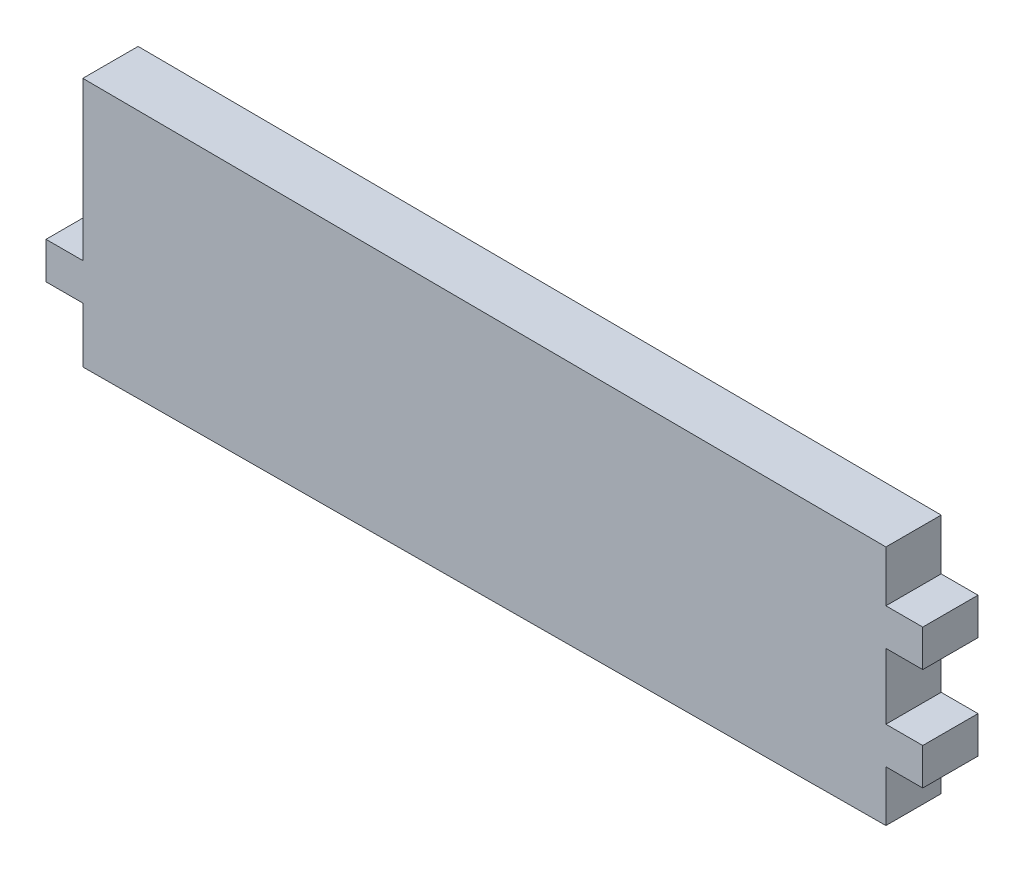
ISO-10303-21;
HEADER;
FILE_DESCRIPTION(('STEP AP214'),'2;1');
FILE_NAME('part.step','',(''),(''),'','','');
FILE_SCHEMA(('AUTOMOTIVE_DESIGN { 1 0 10303 214 1 1 1 1 }'));
ENDSEC;
DATA;
#1=APPLICATION_CONTEXT('core data for automotive mechanical design processes');
#2=APPLICATION_PROTOCOL_DEFINITION('international standard','automotive_design',2000,#1);
#3=PRODUCT_CONTEXT('',#1,'mechanical');
#4=PRODUCT('Part','Part','',(#3));
#5=PRODUCT_RELATED_PRODUCT_CATEGORY('part','',(#4));
#6=PRODUCT_DEFINITION_FORMATION('','',#4);
#7=PRODUCT_DEFINITION_CONTEXT('part definition',#1,'design');
#8=PRODUCT_DEFINITION('design','',#6,#7);
#9=PRODUCT_DEFINITION_SHAPE('','',#8);
#10=(LENGTH_UNIT() NAMED_UNIT(*) SI_UNIT(.MILLI.,.METRE.));
#11=(NAMED_UNIT(*) PLANE_ANGLE_UNIT() SI_UNIT($,.RADIAN.));
#12=(NAMED_UNIT(*) SI_UNIT($,.STERADIAN.) SOLID_ANGLE_UNIT());
#13=UNCERTAINTY_MEASURE_WITH_UNIT(LENGTH_MEASURE(1.E-05),#10,'distance_accuracy_value','');
#14=(GEOMETRIC_REPRESENTATION_CONTEXT(3) GLOBAL_UNCERTAINTY_ASSIGNED_CONTEXT((#13)) GLOBAL_UNIT_ASSIGNED_CONTEXT((#10,
#11,#12)) REPRESENTATION_CONTEXT('',''));
#15=CARTESIAN_POINT('',(0.,0.,0.));
#16=DIRECTION('',(0.,0.,1.));
#17=DIRECTION('',(1.,0.,0.));
#18=AXIS2_PLACEMENT_3D('',#15,#16,#17);
#19=CARTESIAN_POINT('',(129.113772097214,-23.2863674981757,83.3391701718585));
#20=DIRECTION('',(1.,0.,0.));
#21=DIRECTION('',(0.,0.,-1.));
#22=AXIS2_PLACEMENT_3D('',#19,#20,#21);
#23=PLANE('',#22);
#24=DIRECTION('',(0.,-1.,0.));
#25=VECTOR('',#24,1.);
#26=CARTESIAN_POINT('',(129.113772097214,-23.2863674981757,4.7625));
#27=LINE('',#26,#25);
#28=CARTESIAN_POINT('',(129.113772097214,-23.2863674981757,4.7625));
#29=VERTEX_POINT('',#28);
#30=CARTESIAN_POINT('',(129.113772097214,-26.4613674981758,4.7625));
#31=VERTEX_POINT('',#30);
#32=EDGE_CURVE('E203',#29,#31,#27,.T.);
#33=ORIENTED_EDGE('',*,*,#32,.F.);
#34=DIRECTION('',(0.,0.,-1.));
#35=VECTOR('',#34,1.);
#36=CARTESIAN_POINT('',(129.113772097214,-23.2863674981757,83.3391701718585));
#37=LINE('',#36,#35);
#38=CARTESIAN_POINT('',(129.113772097214,-23.2863674981757,0.));
#39=VERTEX_POINT('',#38);
#40=EDGE_CURVE('E36',#29,#39,#37,.T.);
#41=ORIENTED_EDGE('',*,*,#40,.T.);
#42=DIRECTION('',(0.,-1.,0.));
#43=VECTOR('',#42,1.);
#44=CARTESIAN_POINT('',(129.113772097214,-23.2863674981757,0.));
#45=LINE('',#44,#43);
#46=CARTESIAN_POINT('',(129.113772097214,-26.4613674981758,0.));
#47=VERTEX_POINT('',#46);
#48=EDGE_CURVE('E211',#39,#47,#45,.T.);
#49=ORIENTED_EDGE('',*,*,#48,.T.);
#50=DIRECTION('',(0.,0.,-1.));
#51=VECTOR('',#50,1.);
#52=CARTESIAN_POINT('',(129.113772097214,-26.4613674981758,83.3391701718585));
#53=LINE('',#52,#51);
#54=EDGE_CURVE('E119',#31,#47,#53,.T.);
#55=ORIENTED_EDGE('',*,*,#54,.F.);
#56=EDGE_LOOP('',(#33,#41,#49,#55));
#57=FACE_BOUND('',#56,.T.);
#58=ADVANCED_FACE('F32',(#57),#23,.F.);
#59=CARTESIAN_POINT('',(129.113772097214,-26.4613674981758,83.3391701718585));
#60=DIRECTION('',(0.,1.,0.));
#61=DIRECTION('',(0.,0.,1.));
#62=AXIS2_PLACEMENT_3D('',#59,#60,#61);
#63=PLANE('',#62);
#64=DIRECTION('',(1.,0.,0.));
#65=VECTOR('',#64,1.);
#66=CARTESIAN_POINT('',(129.113772097214,-26.4613674981758,4.7625));
#67=LINE('',#66,#65);
#68=CARTESIAN_POINT('',(132.288772097214,-26.4613674981758,4.7625));
#69=VERTEX_POINT('',#68);
#70=EDGE_CURVE('E126',#31,#69,#67,.T.);
#71=ORIENTED_EDGE('',*,*,#70,.F.);
#72=ORIENTED_EDGE('',*,*,#54,.T.);
#73=DIRECTION('',(1.,0.,0.));
#74=VECTOR('',#73,1.);
#75=CARTESIAN_POINT('',(129.113772097214,-26.4613674981758,0.));
#76=LINE('',#75,#74);
#77=CARTESIAN_POINT('',(132.288772097214,-26.4613674981758,0.));
#78=VERTEX_POINT('',#77);
#79=EDGE_CURVE('E210',#47,#78,#76,.T.);
#80=ORIENTED_EDGE('',*,*,#79,.T.);
#81=DIRECTION('',(0.,0.,-1.));
#82=VECTOR('',#81,1.);
#83=CARTESIAN_POINT('',(132.288772097214,-26.4613674981758,83.3391701718585));
#84=LINE('',#83,#82);
#85=EDGE_CURVE('E212',#69,#78,#84,.T.);
#86=ORIENTED_EDGE('',*,*,#85,.F.);
#87=EDGE_LOOP('',(#71,#72,#80,#86));
#88=FACE_BOUND('',#87,.T.);
#89=ADVANCED_FACE('F281',(#88),#63,.F.);
#90=CARTESIAN_POINT('',(132.288772097214,-26.4613674981758,83.3391701718585));
#91=DIRECTION('',(1.,0.,0.));
#92=DIRECTION('',(0.,0.,-1.));
#93=AXIS2_PLACEMENT_3D('',#90,#91,#92);
#94=PLANE('',#93);
#95=DIRECTION('',(0.,-1.,0.));
#96=VECTOR('',#95,1.);
#97=CARTESIAN_POINT('',(132.288772097214,-26.4613674981758,4.7625));
#98=LINE('',#97,#96);
#99=CARTESIAN_POINT('',(132.288772097214,-31.227230037814,4.7625));
#100=VERTEX_POINT('',#99);
#101=EDGE_CURVE('E199',#69,#100,#98,.T.);
#102=ORIENTED_EDGE('',*,*,#101,.F.);
#103=ORIENTED_EDGE('',*,*,#85,.T.);
#104=DIRECTION('',(0.,-1.,0.));
#105=VECTOR('',#104,1.);
#106=CARTESIAN_POINT('',(132.288772097214,-26.4613674981758,0.));
#107=LINE('',#106,#105);
#108=CARTESIAN_POINT('',(132.288772097214,-31.227230037814,0.));
#109=VERTEX_POINT('',#108);
#110=EDGE_CURVE('E214',#78,#109,#107,.T.);
#111=ORIENTED_EDGE('',*,*,#110,.T.);
#112=DIRECTION('',(0.,0.,-1.));
#113=VECTOR('',#112,1.);
#114=CARTESIAN_POINT('',(132.288772097214,-31.227230037814,83.3391701718585));
#115=LINE('',#114,#113);
#116=EDGE_CURVE('E215',#100,#109,#115,.T.);
#117=ORIENTED_EDGE('',*,*,#116,.F.);
#118=EDGE_LOOP('',(#102,#103,#111,#117));
#119=FACE_BOUND('',#118,.T.);
#120=ADVANCED_FACE('F284',(#119),#94,.F.);
#121=CARTESIAN_POINT('',(201.503772097214,-30.8534511460152,83.3391701718585));
#122=DIRECTION('',(-0.0054001797543884,0.999985418923006,0.));
#123=DIRECTION('',(-0.999985418923006,-0.0054001797543884,0.));
#124=AXIS2_PLACEMENT_3D('',#121,#122,#123);
#125=PLANE('',#124);
#126=DIRECTION('',(0.999985418923006,0.0054001797543884,0.));
#127=VECTOR('',#126,1.);
#128=CARTESIAN_POINT('',(201.503772097214,-30.8534511460152,4.7625));
#129=LINE('',#128,#127);
#130=CARTESIAN_POINT('',(201.503772097214,-30.8534511460152,4.7625));
#131=VERTEX_POINT('',#130);
#132=EDGE_CURVE('E196',#100,#131,#129,.T.);
#133=ORIENTED_EDGE('',*,*,#132,.F.);
#134=ORIENTED_EDGE('',*,*,#116,.T.);
#135=DIRECTION('',(0.999985418923006,0.0054001797543884,0.));
#136=VECTOR('',#135,1.);
#137=CARTESIAN_POINT('',(201.503772097214,-30.8534511460152,0.));
#138=LINE('',#137,#136);
#139=CARTESIAN_POINT('',(201.503772097214,-30.8534511460152,0.));
#140=VERTEX_POINT('',#139);
#141=EDGE_CURVE('E217',#109,#140,#138,.T.);
#142=ORIENTED_EDGE('',*,*,#141,.T.);
#143=DIRECTION('',(0.,0.,-1.));
#144=VECTOR('',#143,1.);
#145=CARTESIAN_POINT('',(201.503772097214,-30.8534511460152,83.3391701718585));
#146=LINE('',#145,#144);
#147=EDGE_CURVE('E218',#131,#140,#146,.T.);
#148=ORIENTED_EDGE('',*,*,#147,.F.);
#149=EDGE_LOOP('',(#133,#134,#142,#148));
#150=FACE_BOUND('',#149,.T.);
#151=ADVANCED_FACE('F286',(#150),#125,.F.);
#152=CARTESIAN_POINT('',(201.503772097214,-26.4613674981758,83.3391701718585));
#153=DIRECTION('',(-1.,0.,0.));
#154=DIRECTION('',(0.,0.,1.));
#155=AXIS2_PLACEMENT_3D('',#152,#153,#154);
#156=PLANE('',#155);
#157=DIRECTION('',(0.,1.,0.));
#158=VECTOR('',#157,1.);
#159=CARTESIAN_POINT('',(201.503772097214,-26.4613674981758,4.7625));
#160=LINE('',#159,#158);
#161=CARTESIAN_POINT('',(201.503772097214,-26.4613674981758,4.7625));
#162=VERTEX_POINT('',#161);
#163=EDGE_CURVE('E193',#131,#162,#160,.T.);
#164=ORIENTED_EDGE('',*,*,#163,.F.);
#165=ORIENTED_EDGE('',*,*,#147,.T.);
#166=DIRECTION('',(0.,1.,0.));
#167=VECTOR('',#166,1.);
#168=CARTESIAN_POINT('',(201.503772097214,-26.4613674981758,0.));
#169=LINE('',#168,#167);
#170=CARTESIAN_POINT('',(201.503772097214,-26.4613674981758,0.));
#171=VERTEX_POINT('',#170);
#172=EDGE_CURVE('E220',#140,#171,#169,.T.);
#173=ORIENTED_EDGE('',*,*,#172,.T.);
#174=DIRECTION('',(0.,0.,-1.));
#175=VECTOR('',#174,1.);
#176=CARTESIAN_POINT('',(201.503772097214,-26.4613674981758,83.3391701718585));
#177=LINE('',#176,#175);
#178=EDGE_CURVE('E221',#162,#171,#177,.T.);
#179=ORIENTED_EDGE('',*,*,#178,.F.);
#180=EDGE_LOOP('',(#164,#165,#173,#179));
#181=FACE_BOUND('',#180,.T.);
#182=ADVANCED_FACE('F290',(#181),#156,.F.);
#183=CARTESIAN_POINT('',(201.503772097214,-26.4613674981758,83.3391701718585));
#184=DIRECTION('',(0.,1.,0.));
#185=DIRECTION('',(0.,0.,1.));
#186=AXIS2_PLACEMENT_3D('',#183,#184,#185);
#187=PLANE('',#186);
#188=DIRECTION('',(1.,0.,0.));
#189=VECTOR('',#188,1.);
#190=CARTESIAN_POINT('',(201.503772097214,-26.4613674981758,4.7625));
#191=LINE('',#190,#189);
#192=CARTESIAN_POINT('',(204.678772097214,-26.4613674981758,4.7625));
#193=VERTEX_POINT('',#192);
#194=EDGE_CURVE('E190',#162,#193,#191,.T.);
#195=ORIENTED_EDGE('',*,*,#194,.F.);
#196=ORIENTED_EDGE('',*,*,#178,.T.);
#197=DIRECTION('',(1.,0.,0.));
#198=VECTOR('',#197,1.);
#199=CARTESIAN_POINT('',(201.503772097214,-26.4613674981758,0.));
#200=LINE('',#199,#198);
#201=CARTESIAN_POINT('',(204.678772097214,-26.4613674981758,0.));
#202=VERTEX_POINT('',#201);
#203=EDGE_CURVE('E223',#171,#202,#200,.T.);
#204=ORIENTED_EDGE('',*,*,#203,.T.);
#205=DIRECTION('',(0.,0.,-1.));
#206=VECTOR('',#205,1.);
#207=CARTESIAN_POINT('',(204.678772097214,-26.4613674981758,83.3391701718585));
#208=LINE('',#207,#206);
#209=EDGE_CURVE('E224',#193,#202,#208,.T.);
#210=ORIENTED_EDGE('',*,*,#209,.F.);
#211=EDGE_LOOP('',(#195,#196,#204,#210));
#212=FACE_BOUND('',#211,.T.);
#213=ADVANCED_FACE('F295',(#212),#187,.F.);
#214=CARTESIAN_POINT('',(204.678772097214,-26.4613674981758,83.3391701718585));
#215=DIRECTION('',(-1.,0.,0.));
#216=DIRECTION('',(0.,0.,1.));
#217=AXIS2_PLACEMENT_3D('',#214,#215,#216);
#218=PLANE('',#217);
#219=DIRECTION('',(0.,1.,0.));
#220=VECTOR('',#219,1.);
#221=CARTESIAN_POINT('',(204.678772097214,-26.4613674981758,4.7625));
#222=LINE('',#221,#220);
#223=CARTESIAN_POINT('',(204.678772097214,-23.2863674981757,4.7625));
#224=VERTEX_POINT('',#223);
#225=EDGE_CURVE('E187',#193,#224,#222,.T.);
#226=ORIENTED_EDGE('',*,*,#225,.F.);
#227=ORIENTED_EDGE('',*,*,#209,.T.);
#228=DIRECTION('',(0.,1.,0.));
#229=VECTOR('',#228,1.);
#230=CARTESIAN_POINT('',(204.678772097214,-26.4613674981758,0.));
#231=LINE('',#230,#229);
#232=CARTESIAN_POINT('',(204.678772097214,-23.2863674981757,0.));
#233=VERTEX_POINT('',#232);
#234=EDGE_CURVE('E226',#202,#233,#231,.T.);
#235=ORIENTED_EDGE('',*,*,#234,.T.);
#236=DIRECTION('',(0.,0.,-1.));
#237=VECTOR('',#236,1.);
#238=CARTESIAN_POINT('',(204.678772097214,-23.2863674981757,83.3391701718585));
#239=LINE('',#238,#237);
#240=EDGE_CURVE('E227',#224,#233,#239,.T.);
#241=ORIENTED_EDGE('',*,*,#240,.F.);
#242=EDGE_LOOP('',(#226,#227,#235,#241));
#243=FACE_BOUND('',#242,.T.);
#244=ADVANCED_FACE('F298',(#243),#218,.F.);
#245=CARTESIAN_POINT('',(204.678772097214,-23.2863674981757,83.3391701718585));
#246=DIRECTION('',(0.,-1.,0.));
#247=DIRECTION('',(0.,0.,-1.));
#248=AXIS2_PLACEMENT_3D('',#245,#246,#247);
#249=PLANE('',#248);
#250=DIRECTION('',(-1.,0.,0.));
#251=VECTOR('',#250,1.);
#252=CARTESIAN_POINT('',(204.678772097214,-23.2863674981757,4.7625));
#253=LINE('',#252,#251);
#254=CARTESIAN_POINT('',(201.503772097214,-23.2863674981757,4.7625));
#255=VERTEX_POINT('',#254);
#256=EDGE_CURVE('E184',#224,#255,#253,.T.);
#257=ORIENTED_EDGE('',*,*,#256,.F.);
#258=ORIENTED_EDGE('',*,*,#240,.T.);
#259=DIRECTION('',(-1.,0.,0.));
#260=VECTOR('',#259,1.);
#261=CARTESIAN_POINT('',(204.678772097214,-23.2863674981757,0.));
#262=LINE('',#261,#260);
#263=CARTESIAN_POINT('',(201.503772097214,-23.2863674981757,0.));
#264=VERTEX_POINT('',#263);
#265=EDGE_CURVE('E229',#233,#264,#262,.T.);
#266=ORIENTED_EDGE('',*,*,#265,.T.);
#267=DIRECTION('',(0.,0.,-1.));
#268=VECTOR('',#267,1.);
#269=CARTESIAN_POINT('',(201.503772097214,-23.2863674981757,83.3391701718585));
#270=LINE('',#269,#268);
#271=EDGE_CURVE('E230',#255,#264,#270,.T.);
#272=ORIENTED_EDGE('',*,*,#271,.F.);
#273=EDGE_LOOP('',(#257,#258,#266,#272));
#274=FACE_BOUND('',#273,.T.);
#275=ADVANCED_FACE('F302',(#274),#249,.F.);
#276=CARTESIAN_POINT('',(201.503772097214,-23.2863674981757,83.3391701718585));
#277=DIRECTION('',(-1.,0.,0.));
#278=DIRECTION('',(0.,0.,1.));
#279=AXIS2_PLACEMENT_3D('',#276,#277,#278);
#280=PLANE('',#279);
#281=DIRECTION('',(0.,1.,0.));
#282=VECTOR('',#281,1.);
#283=CARTESIAN_POINT('',(201.503772097214,-23.2863674981757,4.7625));
#284=LINE('',#283,#282);
#285=CARTESIAN_POINT('',(201.503772097214,-17.6221674981757,4.7625));
#286=VERTEX_POINT('',#285);
#287=EDGE_CURVE('E181',#255,#286,#284,.T.);
#288=ORIENTED_EDGE('',*,*,#287,.F.);
#289=ORIENTED_EDGE('',*,*,#271,.T.);
#290=DIRECTION('',(0.,1.,0.));
#291=VECTOR('',#290,1.);
#292=CARTESIAN_POINT('',(201.503772097214,-23.2863674981757,0.));
#293=LINE('',#292,#291);
#294=CARTESIAN_POINT('',(201.503772097214,-17.6221674981757,0.));
#295=VERTEX_POINT('',#294);
#296=EDGE_CURVE('E232',#264,#295,#293,.T.);
#297=ORIENTED_EDGE('',*,*,#296,.T.);
#298=DIRECTION('',(0.,0.,-1.));
#299=VECTOR('',#298,1.);
#300=CARTESIAN_POINT('',(201.503772097214,-17.6221674981757,83.3391701718585));
#301=LINE('',#300,#299);
#302=EDGE_CURVE('E233',#286,#295,#301,.T.);
#303=ORIENTED_EDGE('',*,*,#302,.F.);
#304=EDGE_LOOP('',(#288,#289,#297,#303));
#305=FACE_BOUND('',#304,.T.);
#306=ADVANCED_FACE('F307',(#305),#280,.F.);
#307=CARTESIAN_POINT('',(201.503772097214,-17.6221674981757,83.3391701718585));
#308=DIRECTION('',(0.,1.,0.));
#309=DIRECTION('',(0.,0.,1.));
#310=AXIS2_PLACEMENT_3D('',#307,#308,#309);
#311=PLANE('',#310);
#312=DIRECTION('',(1.,0.,0.));
#313=VECTOR('',#312,1.);
#314=CARTESIAN_POINT('',(201.503772097214,-17.6221674981757,4.7625));
#315=LINE('',#314,#313);
#316=CARTESIAN_POINT('',(204.678772097214,-17.6221674981757,4.7625));
#317=VERTEX_POINT('',#316);
#318=EDGE_CURVE('E178',#286,#317,#315,.T.);
#319=ORIENTED_EDGE('',*,*,#318,.F.);
#320=ORIENTED_EDGE('',*,*,#302,.T.);
#321=DIRECTION('',(1.,0.,0.));
#322=VECTOR('',#321,1.);
#323=CARTESIAN_POINT('',(201.503772097214,-17.6221674981757,0.));
#324=LINE('',#323,#322);
#325=CARTESIAN_POINT('',(204.678772097214,-17.6221674981757,0.));
#326=VERTEX_POINT('',#325);
#327=EDGE_CURVE('E235',#295,#326,#324,.T.);
#328=ORIENTED_EDGE('',*,*,#327,.T.);
#329=DIRECTION('',(0.,0.,-1.));
#330=VECTOR('',#329,1.);
#331=CARTESIAN_POINT('',(204.678772097214,-17.6221674981757,83.3391701718585));
#332=LINE('',#331,#330);
#333=EDGE_CURVE('E236',#317,#326,#332,.T.);
#334=ORIENTED_EDGE('',*,*,#333,.F.);
#335=EDGE_LOOP('',(#319,#320,#328,#334));
#336=FACE_BOUND('',#335,.T.);
#337=ADVANCED_FACE('F310',(#336),#311,.F.);
#338=CARTESIAN_POINT('',(204.678772097214,-17.6221674981757,83.3391701718585));
#339=DIRECTION('',(-1.,0.,0.));
#340=DIRECTION('',(0.,0.,1.));
#341=AXIS2_PLACEMENT_3D('',#338,#339,#340);
#342=PLANE('',#341);
#343=DIRECTION('',(0.,1.,0.));
#344=VECTOR('',#343,1.);
#345=CARTESIAN_POINT('',(204.678772097214,-17.6221674981757,4.7625));
#346=LINE('',#345,#344);
#347=CARTESIAN_POINT('',(204.678772097214,-14.4471674981757,4.7625));
#348=VERTEX_POINT('',#347);
#349=EDGE_CURVE('E175',#317,#348,#346,.T.);
#350=ORIENTED_EDGE('',*,*,#349,.F.);
#351=ORIENTED_EDGE('',*,*,#333,.T.);
#352=DIRECTION('',(0.,1.,0.));
#353=VECTOR('',#352,1.);
#354=CARTESIAN_POINT('',(204.678772097214,-17.6221674981757,0.));
#355=LINE('',#354,#353);
#356=CARTESIAN_POINT('',(204.678772097214,-14.4471674981757,0.));
#357=VERTEX_POINT('',#356);
#358=EDGE_CURVE('E238',#326,#357,#355,.T.);
#359=ORIENTED_EDGE('',*,*,#358,.T.);
#360=DIRECTION('',(0.,0.,-1.));
#361=VECTOR('',#360,1.);
#362=CARTESIAN_POINT('',(204.678772097214,-14.4471674981757,83.3391701718585));
#363=LINE('',#362,#361);
#364=EDGE_CURVE('E239',#348,#357,#363,.T.);
#365=ORIENTED_EDGE('',*,*,#364,.F.);
#366=EDGE_LOOP('',(#350,#351,#359,#365));
#367=FACE_BOUND('',#366,.T.);
#368=ADVANCED_FACE('F314',(#367),#342,.F.);
#369=CARTESIAN_POINT('',(204.678772097214,-14.4471674981757,83.3391701718585));
#370=DIRECTION('',(0.,-1.,0.));
#371=DIRECTION('',(0.,0.,-1.));
#372=AXIS2_PLACEMENT_3D('',#369,#370,#371);
#373=PLANE('',#372);
#374=DIRECTION('',(-1.,0.,0.));
#375=VECTOR('',#374,1.);
#376=CARTESIAN_POINT('',(204.678772097214,-14.4471674981757,4.7625));
#377=LINE('',#376,#375);
#378=CARTESIAN_POINT('',(201.503772097214,-14.4471674981757,4.7625));
#379=VERTEX_POINT('',#378);
#380=EDGE_CURVE('E170',#348,#379,#377,.T.);
#381=ORIENTED_EDGE('',*,*,#380,.F.);
#382=ORIENTED_EDGE('',*,*,#364,.T.);
#383=DIRECTION('',(-1.,0.,0.));
#384=VECTOR('',#383,1.);
#385=CARTESIAN_POINT('',(204.678772097214,-14.4471674981757,0.));
#386=LINE('',#385,#384);
#387=CARTESIAN_POINT('',(201.503772097214,-14.4471674981757,0.));
#388=VERTEX_POINT('',#387);
#389=EDGE_CURVE('E241',#357,#388,#386,.T.);
#390=ORIENTED_EDGE('',*,*,#389,.T.);
#391=DIRECTION('',(0.,0.,-1.));
#392=VECTOR('',#391,1.);
#393=CARTESIAN_POINT('',(201.503772097214,-14.4471674981757,83.3391701718585));
#394=LINE('',#393,#392);
#395=EDGE_CURVE('E242',#379,#388,#394,.T.);
#396=ORIENTED_EDGE('',*,*,#395,.F.);
#397=EDGE_LOOP('',(#381,#382,#390,#396));
#398=FACE_BOUND('',#397,.T.);
#399=ADVANCED_FACE('F319',(#398),#373,.F.);
#400=CARTESIAN_POINT('',(201.503772097214,-14.4471674981757,83.3391701718585));
#401=DIRECTION('',(-1.,0.,0.));
#402=DIRECTION('',(0.,0.,1.));
#403=AXIS2_PLACEMENT_3D('',#400,#401,#402);
#404=PLANE('',#403);
#405=DIRECTION('',(0.,1.,0.));
#406=VECTOR('',#405,1.);
#407=CARTESIAN_POINT('',(201.503772097214,-14.4471674981757,4.7625));
#408=LINE('',#407,#406);
#409=CARTESIAN_POINT('',(201.503772097214,-10.055191910908,4.7625));
#410=VERTEX_POINT('',#409);
#411=EDGE_CURVE('E168',#379,#410,#408,.T.);
#412=ORIENTED_EDGE('',*,*,#411,.F.);
#413=ORIENTED_EDGE('',*,*,#395,.T.);
#414=DIRECTION('',(0.,1.,0.));
#415=VECTOR('',#414,1.);
#416=CARTESIAN_POINT('',(201.503772097214,-14.4471674981757,0.));
#417=LINE('',#416,#415);
#418=CARTESIAN_POINT('',(201.503772097214,-10.055191910908,0.));
#419=VERTEX_POINT('',#418);
#420=EDGE_CURVE('E244',#388,#419,#417,.T.);
#421=ORIENTED_EDGE('',*,*,#420,.T.);
#422=DIRECTION('',(0.,0.,-1.));
#423=VECTOR('',#422,1.);
#424=CARTESIAN_POINT('',(201.503772097214,-10.055191910908,83.3391701718585));
#425=LINE('',#424,#423);
#426=EDGE_CURVE('E245',#410,#419,#425,.T.);
#427=ORIENTED_EDGE('',*,*,#426,.F.);
#428=EDGE_LOOP('',(#412,#413,#421,#427));
#429=FACE_BOUND('',#428,.T.);
#430=ADVANCED_FACE('F322',(#429),#404,.F.);
#431=CARTESIAN_POINT('',(201.503772097214,-10.055191910908,83.3391701718585));
#432=DIRECTION('',(-0.0054007293511391,-0.999985415954891,0.));
#433=DIRECTION('',(0.999985415954891,-0.0054007293511391,0.));
#434=AXIS2_PLACEMENT_3D('',#431,#432,#433);
#435=PLANE('',#434);
#436=DIRECTION('',(-0.999985415954891,0.0054007293511391,0.));
#437=VECTOR('',#436,1.);
#438=CARTESIAN_POINT('',(201.503772097214,-10.055191910908,4.7625));
#439=LINE('',#438,#437);
#440=CARTESIAN_POINT('',(132.288772097214,-9.68137497710586,4.7625));
#441=VERTEX_POINT('',#440);
#442=EDGE_CURVE('E41',#410,#441,#439,.T.);
#443=ORIENTED_EDGE('',*,*,#442,.F.);
#444=ORIENTED_EDGE('',*,*,#426,.T.);
#445=DIRECTION('',(-0.999985415954891,0.0054007293511391,0.));
#446=VECTOR('',#445,1.);
#447=CARTESIAN_POINT('',(201.503772097214,-10.055191910908,0.));
#448=LINE('',#447,#446);
#449=CARTESIAN_POINT('',(132.288772097214,-9.68137497710586,0.));
#450=VERTEX_POINT('',#449);
#451=EDGE_CURVE('E162',#419,#450,#448,.T.);
#452=ORIENTED_EDGE('',*,*,#451,.T.);
#453=DIRECTION('',(0.,0.,-1.));
#454=VECTOR('',#453,1.);
#455=CARTESIAN_POINT('',(132.288772097214,-9.68137497710586,83.3391701718585));
#456=LINE('',#455,#454);
#457=EDGE_CURVE('E153',#441,#450,#456,.T.);
#458=ORIENTED_EDGE('',*,*,#457,.F.);
#459=EDGE_LOOP('',(#443,#444,#452,#458));
#460=FACE_BOUND('',#459,.T.);
#461=ADVANCED_FACE('F159',(#460),#435,.F.);
#462=CARTESIAN_POINT('',(132.288772097214,-23.2863674981757,83.3391701718585));
#463=DIRECTION('',(1.,0.,0.));
#464=DIRECTION('',(0.,0.,-1.));
#465=AXIS2_PLACEMENT_3D('',#462,#463,#464);
#466=PLANE('',#465);
#467=DIRECTION('',(0.,-1.,0.));
#468=VECTOR('',#467,1.);
#469=CARTESIAN_POINT('',(132.288772097214,-23.2863674981757,4.7625));
#470=LINE('',#469,#468);
#471=CARTESIAN_POINT('',(132.288772097214,-23.2863674981757,4.7625));
#472=VERTEX_POINT('',#471);
#473=EDGE_CURVE('E11',#441,#472,#470,.T.);
#474=ORIENTED_EDGE('',*,*,#473,.F.);
#475=ORIENTED_EDGE('',*,*,#457,.T.);
#476=DIRECTION('',(0.,-1.,0.));
#477=VECTOR('',#476,1.);
#478=CARTESIAN_POINT('',(132.288772097214,-23.2863674981757,0.));
#479=LINE('',#478,#477);
#480=CARTESIAN_POINT('',(132.288772097214,-23.2863674981757,0.));
#481=VERTEX_POINT('',#480);
#482=EDGE_CURVE('E164',#450,#481,#479,.T.);
#483=ORIENTED_EDGE('',*,*,#482,.T.);
#484=DIRECTION('',(0.,0.,-1.));
#485=VECTOR('',#484,1.);
#486=CARTESIAN_POINT('',(132.288772097214,-23.2863674981757,83.3391701718585));
#487=LINE('',#486,#485);
#488=EDGE_CURVE('E54',#472,#481,#487,.T.);
#489=ORIENTED_EDGE('',*,*,#488,.F.);
#490=EDGE_LOOP('',(#474,#475,#483,#489));
#491=FACE_BOUND('',#490,.T.);
#492=ADVANCED_FACE('F152',(#491),#466,.F.);
#493=CARTESIAN_POINT('',(129.113772097214,-23.2863674981757,83.3391701718585));
#494=DIRECTION('',(0.,-1.,0.));
#495=DIRECTION('',(0.,0.,-1.));
#496=AXIS2_PLACEMENT_3D('',#493,#494,#495);
#497=PLANE('',#496);
#498=DIRECTION('',(-1.,0.,0.));
#499=VECTOR('',#498,1.);
#500=CARTESIAN_POINT('',(129.113772097214,-23.2863674981757,4.7625));
#501=LINE('',#500,#499);
#502=EDGE_CURVE('E206',#472,#29,#501,.T.);
#503=ORIENTED_EDGE('',*,*,#502,.F.);
#504=ORIENTED_EDGE('',*,*,#488,.T.);
#505=DIRECTION('',(-1.,0.,0.));
#506=VECTOR('',#505,1.);
#507=CARTESIAN_POINT('',(129.113772097214,-23.2863674981757,0.));
#508=LINE('',#507,#506);
#509=EDGE_CURVE('E208',#481,#39,#508,.T.);
#510=ORIENTED_EDGE('',*,*,#509,.T.);
#511=ORIENTED_EDGE('',*,*,#40,.F.);
#512=EDGE_LOOP('',(#503,#504,#510,#511));
#513=FACE_BOUND('',#512,.T.);
#514=ADVANCED_FACE('F276',(#513),#497,.F.);
#515=CARTESIAN_POINT('',(0.,0.,0.));
#516=DIRECTION('',(0.,0.,1.));
#517=DIRECTION('',(1.,0.,0.));
#518=AXIS2_PLACEMENT_3D('',#515,#516,#517);
#519=PLANE('',#518);
#520=ORIENTED_EDGE('',*,*,#48,.F.);
#521=ORIENTED_EDGE('',*,*,#509,.F.);
#522=ORIENTED_EDGE('',*,*,#482,.F.);
#523=ORIENTED_EDGE('',*,*,#451,.F.);
#524=ORIENTED_EDGE('',*,*,#420,.F.);
#525=ORIENTED_EDGE('',*,*,#389,.F.);
#526=ORIENTED_EDGE('',*,*,#358,.F.);
#527=ORIENTED_EDGE('',*,*,#327,.F.);
#528=ORIENTED_EDGE('',*,*,#296,.F.);
#529=ORIENTED_EDGE('',*,*,#265,.F.);
#530=ORIENTED_EDGE('',*,*,#234,.F.);
#531=ORIENTED_EDGE('',*,*,#203,.F.);
#532=ORIENTED_EDGE('',*,*,#172,.F.);
#533=ORIENTED_EDGE('',*,*,#141,.F.);
#534=ORIENTED_EDGE('',*,*,#110,.F.);
#535=ORIENTED_EDGE('',*,*,#79,.F.);
#536=EDGE_LOOP('',(#520,#521,#522,#523,#524,#525,#526,#527,#528,#529,#530,#531,#532,#533,#534,#535));
#537=FACE_BOUND('',#536,.T.);
#538=ADVANCED_FACE('F278',(#537),#519,.F.);
#539=CARTESIAN_POINT('',(283.54158093923,-26.4613674981758,4.7625));
#540=DIRECTION('',(0.,0.,1.));
#541=DIRECTION('',(1.,0.,0.));
#542=AXIS2_PLACEMENT_3D('',#539,#540,#541);
#543=PLANE('',#542);
#544=ORIENTED_EDGE('',*,*,#502,.T.);
#545=ORIENTED_EDGE('',*,*,#32,.T.);
#546=ORIENTED_EDGE('',*,*,#70,.T.);
#547=ORIENTED_EDGE('',*,*,#101,.T.);
#548=ORIENTED_EDGE('',*,*,#132,.T.);
#549=ORIENTED_EDGE('',*,*,#163,.T.);
#550=ORIENTED_EDGE('',*,*,#194,.T.);
#551=ORIENTED_EDGE('',*,*,#225,.T.);
#552=ORIENTED_EDGE('',*,*,#256,.T.);
#553=ORIENTED_EDGE('',*,*,#287,.T.);
#554=ORIENTED_EDGE('',*,*,#318,.T.);
#555=ORIENTED_EDGE('',*,*,#349,.T.);
#556=ORIENTED_EDGE('',*,*,#380,.T.);
#557=ORIENTED_EDGE('',*,*,#411,.T.);
#558=ORIENTED_EDGE('',*,*,#442,.T.);
#559=ORIENTED_EDGE('',*,*,#473,.T.);
#560=EDGE_LOOP('',(#544,#545,#546,#547,#548,#549,#550,#551,#552,#553,#554,#555,#556,#557,#558,#559));
#561=FACE_BOUND('',#560,.T.);
#562=ADVANCED_FACE('F34',(#561),#543,.T.);
#563=CLOSED_SHELL('',(#58,#89,#120,#151,#182,#213,#244,#275,#306,#337,#368,#399,#430,#461,#492,
#514,#538,#562));
#564=MANIFOLD_SOLID_BREP('B2',#563);
#565=ADVANCED_BREP_SHAPE_REPRESENTATION('',(#18,#564),#14);
#566=SHAPE_DEFINITION_REPRESENTATION(#9,#565);
ENDSEC;
END-ISO-10303-21;
